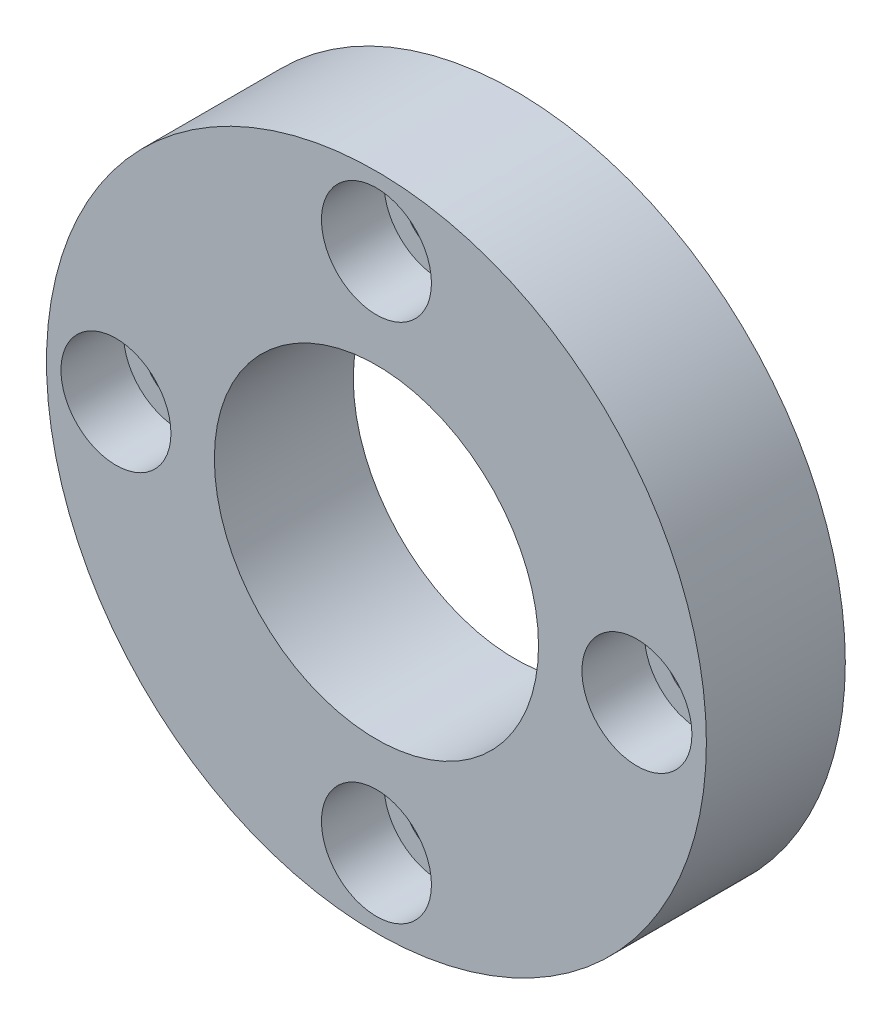
ISO-10303-21;
HEADER;
FILE_DESCRIPTION(('STEP AP214'),'2;1');
FILE_NAME('part.step','',(''),(''),'','','');
FILE_SCHEMA(('AUTOMOTIVE_DESIGN { 1 0 10303 214 1 1 1 1 }'));
ENDSEC;
DATA;
#1=APPLICATION_CONTEXT('core data for automotive mechanical design processes');
#2=APPLICATION_PROTOCOL_DEFINITION('international standard','automotive_design',2000,#1);
#3=PRODUCT_CONTEXT('',#1,'mechanical');
#4=PRODUCT('Part','Part','',(#3));
#5=PRODUCT_RELATED_PRODUCT_CATEGORY('part','',(#4));
#6=PRODUCT_DEFINITION_FORMATION('','',#4);
#7=PRODUCT_DEFINITION_CONTEXT('part definition',#1,'design');
#8=PRODUCT_DEFINITION('design','',#6,#7);
#9=PRODUCT_DEFINITION_SHAPE('','',#8);
#10=(LENGTH_UNIT() NAMED_UNIT(*) SI_UNIT(.MILLI.,.METRE.));
#11=(NAMED_UNIT(*) PLANE_ANGLE_UNIT() SI_UNIT($,.RADIAN.));
#12=(NAMED_UNIT(*) SI_UNIT($,.STERADIAN.) SOLID_ANGLE_UNIT());
#13=UNCERTAINTY_MEASURE_WITH_UNIT(LENGTH_MEASURE(1.E-05),#10,'distance_accuracy_value','');
#14=(GEOMETRIC_REPRESENTATION_CONTEXT(3) GLOBAL_UNCERTAINTY_ASSIGNED_CONTEXT((#13)) GLOBAL_UNIT_ASSIGNED_CONTEXT((#10,
#11,#12)) REPRESENTATION_CONTEXT('',''));
#15=CARTESIAN_POINT('',(0.,0.,0.));
#16=DIRECTION('',(0.,0.,1.));
#17=DIRECTION('',(1.,0.,0.));
#18=AXIS2_PLACEMENT_3D('',#15,#16,#17);
#19=CARTESIAN_POINT('',(0.,22.5,12.));
#20=DIRECTION('',(0.,0.,-1.));
#21=DIRECTION('',(-1.,0.,0.));
#22=AXIS2_PLACEMENT_3D('',#19,#20,#21);
#23=CYLINDRICAL_SURFACE('',#22,3.);
#24=CARTESIAN_POINT('',(0.,22.5,0.));
#25=DIRECTION('',(0.,0.,1.));
#26=DIRECTION('',(1.,0.,0.));
#27=AXIS2_PLACEMENT_3D('',#24,#25,#26);
#28=CIRCLE('',#27,3.);
#29=CARTESIAN_POINT('',(3.,22.5,0.));
#30=VERTEX_POINT('',#29);
#31=EDGE_CURVE('E79',#30,#30,#28,.T.);
#32=ORIENTED_EDGE('',*,*,#31,.F.);
#33=EDGE_LOOP('',(#32));
#34=FACE_BOUND('',#33,.T.);
#35=CARTESIAN_POINT('',(0.,22.5,6.6));
#36=DIRECTION('',(0.,0.,1.));
#37=DIRECTION('',(1.,0.,0.));
#38=AXIS2_PLACEMENT_3D('',#35,#36,#37);
#39=CIRCLE('',#38,3.);
#40=CARTESIAN_POINT('',(3.,22.5,6.6));
#41=VERTEX_POINT('',#40);
#42=EDGE_CURVE('E36',#41,#41,#39,.T.);
#43=ORIENTED_EDGE('',*,*,#42,.T.);
#44=EDGE_LOOP('',(#43));
#45=FACE_BOUND('',#44,.T.);
#46=ADVANCED_FACE('F32',(#34,#45),#23,.F.);
#47=CARTESIAN_POINT('',(22.5000000000006,6.35355279236968E-13,12.));
#48=DIRECTION('',(0.,0.,-1.));
#49=DIRECTION('',(-1.,0.,0.));
#50=AXIS2_PLACEMENT_3D('',#47,#48,#49);
#51=CYLINDRICAL_SURFACE('',#50,3.);
#52=CARTESIAN_POINT('',(22.5000000000006,6.35355279236968E-13,0.));
#53=DIRECTION('',(0.,0.,1.));
#54=DIRECTION('',(1.,0.,0.));
#55=AXIS2_PLACEMENT_3D('',#52,#53,#54);
#56=CIRCLE('',#55,3.);
#57=CARTESIAN_POINT('',(25.5000000000006,6.35355279236968E-13,0.));
#58=VERTEX_POINT('',#57);
#59=EDGE_CURVE('E71',#58,#58,#56,.T.);
#60=ORIENTED_EDGE('',*,*,#59,.F.);
#61=EDGE_LOOP('',(#60));
#62=FACE_BOUND('',#61,.T.);
#63=CARTESIAN_POINT('',(22.5000000000006,6.35355279236968E-13,6.6));
#64=DIRECTION('',(0.,0.,1.));
#65=DIRECTION('',(1.,0.,0.));
#66=AXIS2_PLACEMENT_3D('',#63,#64,#65);
#67=CIRCLE('',#66,3.);
#68=CARTESIAN_POINT('',(25.5000000000006,6.35355279236968E-13,6.6));
#69=VERTEX_POINT('',#68);
#70=EDGE_CURVE('E57',#69,#69,#67,.T.);
#71=ORIENTED_EDGE('',*,*,#70,.T.);
#72=EDGE_LOOP('',(#71));
#73=FACE_BOUND('',#72,.T.);
#74=ADVANCED_FACE('F105',(#62,#73),#51,.F.);
#75=CARTESIAN_POINT('',(1.27071055847394E-12,-22.5,12.));
#76=DIRECTION('',(0.,0.,-1.));
#77=DIRECTION('',(-1.,0.,0.));
#78=AXIS2_PLACEMENT_3D('',#75,#76,#77);
#79=CYLINDRICAL_SURFACE('',#78,3.);
#80=CARTESIAN_POINT('',(1.27071055847394E-12,-22.5,0.));
#81=DIRECTION('',(0.,0.,1.));
#82=DIRECTION('',(1.,0.,0.));
#83=AXIS2_PLACEMENT_3D('',#80,#81,#82);
#84=CIRCLE('',#83,3.);
#85=CARTESIAN_POINT('',(3.00000000000127,-22.5,0.));
#86=VERTEX_POINT('',#85);
#87=EDGE_CURVE('E66',#86,#86,#84,.T.);
#88=ORIENTED_EDGE('',*,*,#87,.F.);
#89=EDGE_LOOP('',(#88));
#90=FACE_BOUND('',#89,.T.);
#91=CARTESIAN_POINT('',(1.27071055847394E-12,-22.5,6.6));
#92=DIRECTION('',(0.,0.,1.));
#93=DIRECTION('',(1.,0.,0.));
#94=AXIS2_PLACEMENT_3D('',#91,#92,#93);
#95=CIRCLE('',#94,3.);
#96=CARTESIAN_POINT('',(3.00000000000127,-22.5,6.6));
#97=VERTEX_POINT('',#96);
#98=EDGE_CURVE('E54',#97,#97,#95,.T.);
#99=ORIENTED_EDGE('',*,*,#98,.T.);
#100=EDGE_LOOP('',(#99));
#101=FACE_BOUND('',#100,.T.);
#102=ADVANCED_FACE('F110',(#90,#101),#79,.F.);
#103=CARTESIAN_POINT('',(-22.4999999999994,-6.38110734535049E-13,12.));
#104=DIRECTION('',(0.,0.,-1.));
#105=DIRECTION('',(-1.,0.,0.));
#106=AXIS2_PLACEMENT_3D('',#103,#104,#105);
#107=CYLINDRICAL_SURFACE('',#106,3.);
#108=CARTESIAN_POINT('',(-22.4999999999994,-6.38110734535049E-13,0.));
#109=DIRECTION('',(0.,0.,1.));
#110=DIRECTION('',(1.,0.,0.));
#111=AXIS2_PLACEMENT_3D('',#108,#109,#110);
#112=CIRCLE('',#111,3.);
#113=CARTESIAN_POINT('',(-19.4999999999994,-6.38110734535049E-13,0.));
#114=VERTEX_POINT('',#113);
#115=EDGE_CURVE('E62',#114,#114,#112,.T.);
#116=ORIENTED_EDGE('',*,*,#115,.F.);
#117=EDGE_LOOP('',(#116));
#118=FACE_BOUND('',#117,.T.);
#119=CARTESIAN_POINT('',(-22.4999999999994,-6.38110734535049E-13,6.6));
#120=DIRECTION('',(0.,0.,1.));
#121=DIRECTION('',(1.,0.,0.));
#122=AXIS2_PLACEMENT_3D('',#119,#120,#121);
#123=CIRCLE('',#122,3.);
#124=CARTESIAN_POINT('',(-19.4999999999994,-6.38110734535049E-13,6.6));
#125=VERTEX_POINT('',#124);
#126=EDGE_CURVE('E51',#125,#125,#123,.T.);
#127=ORIENTED_EDGE('',*,*,#126,.T.);
#128=EDGE_LOOP('',(#127));
#129=FACE_BOUND('',#128,.T.);
#130=ADVANCED_FACE('F117',(#118,#129),#107,.F.);
#131=CARTESIAN_POINT('',(0.,0.,12.));
#132=DIRECTION('',(0.,0.,1.));
#133=DIRECTION('',(1.,0.,0.));
#134=AXIS2_PLACEMENT_3D('',#131,#132,#133);
#135=PLANE('',#134);
#136=CARTESIAN_POINT('',(0.,22.5,12.));
#137=DIRECTION('',(0.,0.,1.));
#138=DIRECTION('',(1.,0.,0.));
#139=AXIS2_PLACEMENT_3D('',#136,#137,#138);
#140=CIRCLE('',#139,4.75);
#141=CARTESIAN_POINT('',(4.75,22.5,12.));
#142=VERTEX_POINT('',#141);
#143=EDGE_CURVE('E154',#142,#142,#140,.T.);
#144=ORIENTED_EDGE('',*,*,#143,.F.);
#145=EDGE_LOOP('',(#144));
#146=FACE_BOUND('',#145,.T.);
#147=CARTESIAN_POINT('',(22.5000000000006,6.35355279236968E-13,12.));
#148=DIRECTION('',(0.,0.,1.));
#149=DIRECTION('',(1.,0.,0.));
#150=AXIS2_PLACEMENT_3D('',#147,#148,#149);
#151=CIRCLE('',#150,4.7500000000005);
#152=CARTESIAN_POINT('',(27.2500000000011,6.35355279236968E-13,12.));
#153=VERTEX_POINT('',#152);
#154=EDGE_CURVE('E162',#153,#153,#151,.T.);
#155=ORIENTED_EDGE('',*,*,#154,.F.);
#156=EDGE_LOOP('',(#155));
#157=FACE_BOUND('',#156,.T.);
#158=CARTESIAN_POINT('',(1.27071055847394E-12,-22.5,12.));
#159=DIRECTION('',(0.,0.,1.));
#160=DIRECTION('',(1.,0.,0.));
#161=AXIS2_PLACEMENT_3D('',#158,#159,#160);
#162=CIRCLE('',#161,4.75000000000137);
#163=CARTESIAN_POINT('',(4.75000000000264,-22.5,12.));
#164=VERTEX_POINT('',#163);
#165=EDGE_CURVE('E168',#164,#164,#162,.T.);
#166=ORIENTED_EDGE('',*,*,#165,.F.);
#167=EDGE_LOOP('',(#166));
#168=FACE_BOUND('',#167,.T.);
#169=CARTESIAN_POINT('',(-22.4999999999994,-6.38110734535049E-13,12.));
#170=DIRECTION('',(0.,0.,1.));
#171=DIRECTION('',(1.,0.,0.));
#172=AXIS2_PLACEMENT_3D('',#169,#170,#171);
#173=CIRCLE('',#172,4.75000000000102);
#174=CARTESIAN_POINT('',(-17.7499999999983,-6.38110734535049E-13,12.));
#175=VERTEX_POINT('',#174);
#176=EDGE_CURVE('E74',#175,#175,#173,.T.);
#177=ORIENTED_EDGE('',*,*,#176,.F.);
#178=EDGE_LOOP('',(#177));
#179=FACE_BOUND('',#178,.T.);
#180=CARTESIAN_POINT('',(0.,0.,12.));
#181=DIRECTION('',(0.,0.,1.));
#182=DIRECTION('',(1.,0.,0.));
#183=AXIS2_PLACEMENT_3D('',#180,#181,#182);
#184=CIRCLE('',#183,28.5);
#185=CARTESIAN_POINT('',(28.5,0.,12.));
#186=VERTEX_POINT('',#185);
#187=EDGE_CURVE('E10',#186,#186,#184,.T.);
#188=ORIENTED_EDGE('',*,*,#187,.T.);
#189=EDGE_LOOP('',(#188));
#190=FACE_BOUND('',#189,.T.);
#191=CARTESIAN_POINT('',(0.,0.,12.));
#192=DIRECTION('',(0.,0.,1.));
#193=DIRECTION('',(1.,0.,0.));
#194=AXIS2_PLACEMENT_3D('',#191,#192,#193);
#195=CIRCLE('',#194,14.);
#196=CARTESIAN_POINT('',(14.,0.,12.));
#197=VERTEX_POINT('',#196);
#198=EDGE_CURVE('E45',#197,#197,#195,.T.);
#199=ORIENTED_EDGE('',*,*,#198,.F.);
#200=EDGE_LOOP('',(#199));
#201=FACE_BOUND('',#200,.T.);
#202=ADVANCED_FACE('F120',(#146,#157,#168,#179,#190,#201),#135,.T.);
#203=CARTESIAN_POINT('',(0.,0.,0.));
#204=DIRECTION('',(0.,0.,1.));
#205=DIRECTION('',(1.,0.,0.));
#206=AXIS2_PLACEMENT_3D('',#203,#204,#205);
#207=PLANE('',#206);
#208=CARTESIAN_POINT('',(0.,0.,0.));
#209=DIRECTION('',(0.,0.,1.));
#210=DIRECTION('',(1.,0.,0.));
#211=AXIS2_PLACEMENT_3D('',#208,#209,#210);
#212=CIRCLE('',#211,28.5);
#213=CARTESIAN_POINT('',(28.5,0.,0.));
#214=VERTEX_POINT('',#213);
#215=EDGE_CURVE('E40',#214,#214,#212,.T.);
#216=ORIENTED_EDGE('',*,*,#215,.F.);
#217=EDGE_LOOP('',(#216));
#218=FACE_BOUND('',#217,.T.);
#219=CARTESIAN_POINT('',(0.,0.,0.));
#220=DIRECTION('',(0.,0.,1.));
#221=DIRECTION('',(1.,0.,0.));
#222=AXIS2_PLACEMENT_3D('',#219,#220,#221);
#223=CIRCLE('',#222,14.);
#224=CARTESIAN_POINT('',(14.,0.,0.));
#225=VERTEX_POINT('',#224);
#226=EDGE_CURVE('E48',#225,#225,#223,.T.);
#227=ORIENTED_EDGE('',*,*,#226,.T.);
#228=EDGE_LOOP('',(#227));
#229=FACE_BOUND('',#228,.T.);
#230=ORIENTED_EDGE('',*,*,#31,.T.);
#231=EDGE_LOOP('',(#230));
#232=FACE_BOUND('',#231,.T.);
#233=ORIENTED_EDGE('',*,*,#59,.T.);
#234=EDGE_LOOP('',(#233));
#235=FACE_BOUND('',#234,.T.);
#236=ORIENTED_EDGE('',*,*,#87,.T.);
#237=EDGE_LOOP('',(#236));
#238=FACE_BOUND('',#237,.T.);
#239=ORIENTED_EDGE('',*,*,#115,.T.);
#240=EDGE_LOOP('',(#239));
#241=FACE_BOUND('',#240,.T.);
#242=ADVANCED_FACE('F87',(#218,#229,#232,#235,#238,#241),#207,.F.);
#243=CARTESIAN_POINT('',(0.,0.,12.));
#244=DIRECTION('',(0.,0.,-1.));
#245=DIRECTION('',(-1.,0.,0.));
#246=AXIS2_PLACEMENT_3D('',#243,#244,#245);
#247=CYLINDRICAL_SURFACE('',#246,28.5);
#248=ORIENTED_EDGE('',*,*,#187,.F.);
#249=EDGE_LOOP('',(#248));
#250=FACE_BOUND('',#249,.T.);
#251=ORIENTED_EDGE('',*,*,#215,.T.);
#252=EDGE_LOOP('',(#251));
#253=FACE_BOUND('',#252,.T.);
#254=ADVANCED_FACE('F34',(#250,#253),#247,.T.);
#255=CARTESIAN_POINT('',(0.,0.,12.));
#256=DIRECTION('',(0.,0.,-1.));
#257=DIRECTION('',(-1.,0.,0.));
#258=AXIS2_PLACEMENT_3D('',#255,#256,#257);
#259=CYLINDRICAL_SURFACE('',#258,14.);
#260=ORIENTED_EDGE('',*,*,#198,.T.);
#261=EDGE_LOOP('',(#260));
#262=FACE_BOUND('',#261,.T.);
#263=ORIENTED_EDGE('',*,*,#226,.F.);
#264=EDGE_LOOP('',(#263));
#265=FACE_BOUND('',#264,.T.);
#266=ADVANCED_FACE('F90',(#262,#265),#259,.F.);
#267=CARTESIAN_POINT('',(-22.4999999999994,-6.38110734535049E-13,6.6));
#268=DIRECTION('',(0.,0.,1.));
#269=DIRECTION('',(1.,0.,0.));
#270=AXIS2_PLACEMENT_3D('',#267,#268,#269);
#271=CYLINDRICAL_SURFACE('',#270,4.75000000000102);
#272=CARTESIAN_POINT('',(-22.4999999999994,-6.38110734535049E-13,6.6));
#273=DIRECTION('',(0.,0.,1.));
#274=DIRECTION('',(1.,0.,0.));
#275=AXIS2_PLACEMENT_3D('',#272,#273,#274);
#276=CIRCLE('',#275,4.75000000000102);
#277=CARTESIAN_POINT('',(-17.7499999999983,-6.38110734535049E-13,6.6));
#278=VERTEX_POINT('',#277);
#279=EDGE_CURVE('E170',#278,#278,#276,.T.);
#280=CARTESIAN_POINT('',(-17.7499999999983,-6.38110734535049E-13,6.6));
#281=CARTESIAN_POINT('',(-17.7499999999983,-6.38110734535049E-13,6.65625));
#282=CARTESIAN_POINT('',(-17.7499999999983,-6.38110734535049E-13,6.7125));
#283=CARTESIAN_POINT('',(-17.7499999999983,-6.38110734535049E-13,6.825));
#284=CARTESIAN_POINT('',(-17.7499999999983,-6.38110734535049E-13,6.88125));
#285=CARTESIAN_POINT('',(-17.7499999999983,-6.38110734535049E-13,6.99375));
#286=CARTESIAN_POINT('',(-17.7499999999983,-6.38110734535049E-13,7.05));
#287=CARTESIAN_POINT('',(-17.7499999999983,-6.38110734535049E-13,7.1625));
#288=CARTESIAN_POINT('',(-17.7499999999983,-6.38110734535049E-13,7.21875));
#289=CARTESIAN_POINT('',(-17.7499999999983,-6.38110734535049E-13,7.33125));
#290=CARTESIAN_POINT('',(-17.7499999999983,-6.38110734535049E-13,7.3875));
#291=CARTESIAN_POINT('',(-17.7499999999983,-6.38110734535049E-13,7.5));
#292=CARTESIAN_POINT('',(-17.7499999999983,-6.38110734535049E-13,7.55625));
#293=CARTESIAN_POINT('',(-17.7499999999983,-6.38110734535049E-13,7.66875));
#294=CARTESIAN_POINT('',(-17.7499999999983,-6.38110734535049E-13,7.725));
#295=CARTESIAN_POINT('',(-17.7499999999983,-6.38110734535049E-13,7.8375));
#296=CARTESIAN_POINT('',(-17.7499999999983,-6.38110734535049E-13,7.89375));
#297=CARTESIAN_POINT('',(-17.7499999999983,-6.38110734535049E-13,8.00625));
#298=CARTESIAN_POINT('',(-17.7499999999983,-6.38110734535049E-13,8.0625));
#299=CARTESIAN_POINT('',(-17.7499999999983,-6.38110734535049E-13,8.175));
#300=CARTESIAN_POINT('',(-17.7499999999983,-6.38110734535049E-13,8.23125));
#301=CARTESIAN_POINT('',(-17.7499999999983,-6.38110734535049E-13,8.34375));
#302=CARTESIAN_POINT('',(-17.7499999999983,-6.38110734535049E-13,8.4));
#303=CARTESIAN_POINT('',(-17.7499999999983,-6.38110734535049E-13,8.5125));
#304=CARTESIAN_POINT('',(-17.7499999999983,-6.38110734535049E-13,8.56875));
#305=CARTESIAN_POINT('',(-17.7499999999983,-6.38110734535049E-13,8.68125));
#306=CARTESIAN_POINT('',(-17.7499999999983,-6.38110734535049E-13,8.7375));
#307=CARTESIAN_POINT('',(-17.7499999999983,-6.38110734535049E-13,8.85));
#308=CARTESIAN_POINT('',(-17.7499999999983,-6.38110734535049E-13,8.90625));
#309=CARTESIAN_POINT('',(-17.7499999999983,-6.38110734535049E-13,9.01875));
#310=CARTESIAN_POINT('',(-17.7499999999983,-6.38110734535049E-13,9.075));
#311=CARTESIAN_POINT('',(-17.7499999999983,-6.38110734535049E-13,9.1875));
#312=CARTESIAN_POINT('',(-17.7499999999983,-6.38110734535049E-13,9.24375));
#313=CARTESIAN_POINT('',(-17.7499999999983,-6.38110734535049E-13,9.35625));
#314=CARTESIAN_POINT('',(-17.7499999999983,-6.38110734535049E-13,9.4125));
#315=CARTESIAN_POINT('',(-17.7499999999983,-6.38110734535049E-13,9.525));
#316=CARTESIAN_POINT('',(-17.7499999999983,-6.38110734535049E-13,9.58125));
#317=CARTESIAN_POINT('',(-17.7499999999983,-6.38110734535049E-13,9.69375));
#318=CARTESIAN_POINT('',(-17.7499999999983,-6.38110734535049E-13,9.75));
#319=CARTESIAN_POINT('',(-17.7499999999983,-6.38110734535049E-13,9.8625));
#320=CARTESIAN_POINT('',(-17.7499999999983,-6.38110734535049E-13,9.91875));
#321=CARTESIAN_POINT('',(-17.7499999999983,-6.38110734535049E-13,10.03125));
#322=CARTESIAN_POINT('',(-17.7499999999983,-6.38110734535049E-13,10.0875));
#323=CARTESIAN_POINT('',(-17.7499999999983,-6.38110734535049E-13,10.2));
#324=CARTESIAN_POINT('',(-17.7499999999983,-6.38110734535049E-13,10.25625));
#325=CARTESIAN_POINT('',(-17.7499999999983,-6.38110734535049E-13,10.36875));
#326=CARTESIAN_POINT('',(-17.7499999999983,-6.38110734535049E-13,10.425));
#327=CARTESIAN_POINT('',(-17.7499999999983,-6.38110734535049E-13,10.5375));
#328=CARTESIAN_POINT('',(-17.7499999999983,-6.38110734535049E-13,10.59375));
#329=CARTESIAN_POINT('',(-17.7499999999983,-6.38110734535049E-13,10.70625));
#330=CARTESIAN_POINT('',(-17.7499999999983,-6.38110734535049E-13,10.7625));
#331=CARTESIAN_POINT('',(-17.7499999999983,-6.38110734535049E-13,10.875));
#332=CARTESIAN_POINT('',(-17.7499999999983,-6.38110734535049E-13,10.93125));
#333=CARTESIAN_POINT('',(-17.7499999999983,-6.38110734535049E-13,11.04375));
#334=CARTESIAN_POINT('',(-17.7499999999983,-6.38110734535049E-13,11.1));
#335=CARTESIAN_POINT('',(-17.7499999999983,-6.38110734535049E-13,11.2125));
#336=CARTESIAN_POINT('',(-17.7499999999983,-6.38110734535049E-13,11.26875));
#337=CARTESIAN_POINT('',(-17.7499999999983,-6.38110734535049E-13,11.38125));
#338=CARTESIAN_POINT('',(-17.7499999999983,-6.38110734535049E-13,11.4375));
#339=CARTESIAN_POINT('',(-17.7499999999983,-6.38110734535049E-13,11.55));
#340=CARTESIAN_POINT('',(-17.7499999999983,-6.38110734535049E-13,11.60625));
#341=CARTESIAN_POINT('',(-17.7499999999983,-6.38110734535049E-13,11.71875));
#342=CARTESIAN_POINT('',(-17.7499999999983,-6.38110734535049E-13,11.775));
#343=CARTESIAN_POINT('',(-17.7499999999983,-6.38110734535049E-13,11.8875));
#344=CARTESIAN_POINT('',(-17.7499999999983,-6.38110734535049E-13,11.94375));
#345=CARTESIAN_POINT('',(-17.7499999999983,-6.38110734535049E-13,12.));
#346=B_SPLINE_CURVE_WITH_KNOTS('',3,(#280,#281,#282,#283,#284,#285,#286,#287,#288,#289,#290,
#291,#292,#293,#294,#295,#296,#297,#298,#299,#300,#301,#302,#303,#304,#305,#306,#307,#308,#309,
#310,#311,#312,#313,#314,#315,#316,#317,#318,#319,#320,#321,#322,#323,#324,#325,#326,#327,#328,
#329,#330,#331,#332,#333,#334,#335,#336,#337,#338,#339,#340,#341,#342,#343,#344,#345),
.UNSPECIFIED.,.F.,.F.,(4,2,2,2,2,2,2,2,2,2,2,2,2,2,2,2,2,2,2,2,2,2,2,2,2,2,2,2,2,2,2,2,4),(0.,
0.168750000000001,0.3375,0.506250000000001,0.675,0.843750000000001,1.0125,1.18125,1.35,1.51875,
1.6875,1.85625,2.025,2.19375,2.3625,2.53125,2.7,2.86875,3.0375,3.20625,3.375,3.54375,3.7125,
3.88125,4.05,4.21875,4.3875,4.55625,4.725,4.89375,5.0625,5.23125,5.4),.UNSPECIFIED.);
#347=EDGE_CURVE('BSEAM92',#278,#175,#346,.T.);
#348=ORIENTED_EDGE('',*,*,#279,.F.);
#349=ORIENTED_EDGE('',*,*,#176,.T.);
#350=ORIENTED_EDGE('',*,*,#347,.T.);
#351=ORIENTED_EDGE('',*,*,#347,.F.);
#352=EDGE_LOOP('',(#348,#350,#349,#351));
#353=FACE_BOUND('',#352,.T.);
#354=ADVANCED_FACE('F92',(#353),#271,.F.);
#355=CARTESIAN_POINT('',(-22.4999999999994,-6.38110734535049E-13,6.6));
#356=DIRECTION('',(0.,0.,1.));
#357=DIRECTION('',(1.,0.,0.));
#358=AXIS2_PLACEMENT_3D('',#355,#356,#357);
#359=PLANE('',#358);
#360=ORIENTED_EDGE('',*,*,#126,.F.);
#361=EDGE_LOOP('',(#360));
#362=FACE_BOUND('',#361,.T.);
#363=ORIENTED_EDGE('',*,*,#279,.T.);
#364=EDGE_LOOP('',(#363));
#365=FACE_BOUND('',#364,.T.);
#366=ADVANCED_FACE('F98',(#362,#365),#359,.T.);
#367=CARTESIAN_POINT('',(1.27071055847394E-12,-22.5,6.6));
#368=DIRECTION('',(0.,0.,1.));
#369=DIRECTION('',(1.,0.,0.));
#370=AXIS2_PLACEMENT_3D('',#367,#368,#369);
#371=CYLINDRICAL_SURFACE('',#370,4.75000000000137);
#372=CARTESIAN_POINT('',(1.27071055847394E-12,-22.5,6.6));
#373=DIRECTION('',(0.,0.,1.));
#374=DIRECTION('',(1.,0.,0.));
#375=AXIS2_PLACEMENT_3D('',#372,#373,#374);
#376=CIRCLE('',#375,4.75000000000137);
#377=CARTESIAN_POINT('',(4.75000000000264,-22.5,6.6));
#378=VERTEX_POINT('',#377);
#379=EDGE_CURVE('E165',#378,#378,#376,.T.);
#380=CARTESIAN_POINT('',(4.75000000000264,-22.5,6.6));
#381=CARTESIAN_POINT('',(4.75000000000264,-22.5,6.65625));
#382=CARTESIAN_POINT('',(4.75000000000264,-22.5,6.7125));
#383=CARTESIAN_POINT('',(4.75000000000264,-22.5,6.825));
#384=CARTESIAN_POINT('',(4.75000000000264,-22.5,6.88125));
#385=CARTESIAN_POINT('',(4.75000000000264,-22.5,6.99375));
#386=CARTESIAN_POINT('',(4.75000000000264,-22.5,7.05));
#387=CARTESIAN_POINT('',(4.75000000000264,-22.5,7.1625));
#388=CARTESIAN_POINT('',(4.75000000000264,-22.5,7.21875));
#389=CARTESIAN_POINT('',(4.75000000000264,-22.5,7.33125));
#390=CARTESIAN_POINT('',(4.75000000000264,-22.5,7.3875));
#391=CARTESIAN_POINT('',(4.75000000000264,-22.5,7.5));
#392=CARTESIAN_POINT('',(4.75000000000264,-22.5,7.55625));
#393=CARTESIAN_POINT('',(4.75000000000264,-22.5,7.66875));
#394=CARTESIAN_POINT('',(4.75000000000264,-22.5,7.725));
#395=CARTESIAN_POINT('',(4.75000000000264,-22.5,7.8375));
#396=CARTESIAN_POINT('',(4.75000000000264,-22.5,7.89375));
#397=CARTESIAN_POINT('',(4.75000000000264,-22.5,8.00625));
#398=CARTESIAN_POINT('',(4.75000000000264,-22.5,8.0625));
#399=CARTESIAN_POINT('',(4.75000000000264,-22.5,8.175));
#400=CARTESIAN_POINT('',(4.75000000000264,-22.5,8.23125));
#401=CARTESIAN_POINT('',(4.75000000000264,-22.5,8.34375));
#402=CARTESIAN_POINT('',(4.75000000000264,-22.5,8.4));
#403=CARTESIAN_POINT('',(4.75000000000264,-22.5,8.5125));
#404=CARTESIAN_POINT('',(4.75000000000264,-22.5,8.56875));
#405=CARTESIAN_POINT('',(4.75000000000264,-22.5,8.68125));
#406=CARTESIAN_POINT('',(4.75000000000264,-22.5,8.7375));
#407=CARTESIAN_POINT('',(4.75000000000264,-22.5,8.85));
#408=CARTESIAN_POINT('',(4.75000000000264,-22.5,8.90625));
#409=CARTESIAN_POINT('',(4.75000000000264,-22.5,9.01875));
#410=CARTESIAN_POINT('',(4.75000000000264,-22.5,9.075));
#411=CARTESIAN_POINT('',(4.75000000000264,-22.5,9.1875));
#412=CARTESIAN_POINT('',(4.75000000000264,-22.5,9.24375));
#413=CARTESIAN_POINT('',(4.75000000000264,-22.5,9.35625));
#414=CARTESIAN_POINT('',(4.75000000000264,-22.5,9.4125));
#415=CARTESIAN_POINT('',(4.75000000000264,-22.5,9.525));
#416=CARTESIAN_POINT('',(4.75000000000264,-22.5,9.58125));
#417=CARTESIAN_POINT('',(4.75000000000264,-22.5,9.69375));
#418=CARTESIAN_POINT('',(4.75000000000264,-22.5,9.75));
#419=CARTESIAN_POINT('',(4.75000000000264,-22.5,9.8625));
#420=CARTESIAN_POINT('',(4.75000000000264,-22.5,9.91875));
#421=CARTESIAN_POINT('',(4.75000000000264,-22.5,10.03125));
#422=CARTESIAN_POINT('',(4.75000000000264,-22.5,10.0875));
#423=CARTESIAN_POINT('',(4.75000000000264,-22.5,10.2));
#424=CARTESIAN_POINT('',(4.75000000000264,-22.5,10.25625));
#425=CARTESIAN_POINT('',(4.75000000000264,-22.5,10.36875));
#426=CARTESIAN_POINT('',(4.75000000000264,-22.5,10.425));
#427=CARTESIAN_POINT('',(4.75000000000264,-22.5,10.5375));
#428=CARTESIAN_POINT('',(4.75000000000264,-22.5,10.59375));
#429=CARTESIAN_POINT('',(4.75000000000264,-22.5,10.70625));
#430=CARTESIAN_POINT('',(4.75000000000264,-22.5,10.7625));
#431=CARTESIAN_POINT('',(4.75000000000264,-22.5,10.875));
#432=CARTESIAN_POINT('',(4.75000000000264,-22.5,10.93125));
#433=CARTESIAN_POINT('',(4.75000000000264,-22.5,11.04375));
#434=CARTESIAN_POINT('',(4.75000000000264,-22.5,11.1));
#435=CARTESIAN_POINT('',(4.75000000000264,-22.5,11.2125));
#436=CARTESIAN_POINT('',(4.75000000000264,-22.5,11.26875));
#437=CARTESIAN_POINT('',(4.75000000000264,-22.5,11.38125));
#438=CARTESIAN_POINT('',(4.75000000000264,-22.5,11.4375));
#439=CARTESIAN_POINT('',(4.75000000000264,-22.5,11.55));
#440=CARTESIAN_POINT('',(4.75000000000264,-22.5,11.60625));
#441=CARTESIAN_POINT('',(4.75000000000264,-22.5,11.71875));
#442=CARTESIAN_POINT('',(4.75000000000264,-22.5,11.775));
#443=CARTESIAN_POINT('',(4.75000000000264,-22.5,11.8875));
#444=CARTESIAN_POINT('',(4.75000000000264,-22.5,11.94375));
#445=CARTESIAN_POINT('',(4.75000000000264,-22.5,12.));
#446=B_SPLINE_CURVE_WITH_KNOTS('',3,(#380,#381,#382,#383,#384,#385,#386,#387,#388,#389,#390,
#391,#392,#393,#394,#395,#396,#397,#398,#399,#400,#401,#402,#403,#404,#405,#406,#407,#408,#409,
#410,#411,#412,#413,#414,#415,#416,#417,#418,#419,#420,#421,#422,#423,#424,#425,#426,#427,#428,
#429,#430,#431,#432,#433,#434,#435,#436,#437,#438,#439,#440,#441,#442,#443,#444,#445),
.UNSPECIFIED.,.F.,.F.,(4,2,2,2,2,2,2,2,2,2,2,2,2,2,2,2,2,2,2,2,2,2,2,2,2,2,2,2,2,2,2,2,4),(0.,
0.168750000000001,0.3375,0.506250000000001,0.675,0.843750000000001,1.0125,1.18125,1.35,1.51875,
1.6875,1.85625,2.025,2.19375,2.3625,2.53125,2.7,2.86875,3.0375,3.20625,3.375,3.54375,3.7125,
3.88125,4.05,4.21875,4.3875,4.55625,4.725,4.89375,5.0625,5.23125,5.4),.UNSPECIFIED.);
#447=EDGE_CURVE('BSEAM125',#378,#164,#446,.T.);
#448=ORIENTED_EDGE('',*,*,#379,.F.);
#449=ORIENTED_EDGE('',*,*,#165,.T.);
#450=ORIENTED_EDGE('',*,*,#447,.T.);
#451=ORIENTED_EDGE('',*,*,#447,.F.);
#452=EDGE_LOOP('',(#448,#450,#449,#451));
#453=FACE_BOUND('',#452,.T.);
#454=ADVANCED_FACE('F125',(#453),#371,.F.);
#455=CARTESIAN_POINT('',(1.27071055847394E-12,-22.5,6.6));
#456=DIRECTION('',(0.,0.,1.));
#457=DIRECTION('',(1.,0.,0.));
#458=AXIS2_PLACEMENT_3D('',#455,#456,#457);
#459=PLANE('',#458);
#460=ORIENTED_EDGE('',*,*,#98,.F.);
#461=EDGE_LOOP('',(#460));
#462=FACE_BOUND('',#461,.T.);
#463=ORIENTED_EDGE('',*,*,#379,.T.);
#464=EDGE_LOOP('',(#463));
#465=FACE_BOUND('',#464,.T.);
#466=ADVANCED_FACE('F129',(#462,#465),#459,.T.);
#467=CARTESIAN_POINT('',(22.5000000000006,6.35355279236968E-13,6.6));
#468=DIRECTION('',(0.,0.,1.));
#469=DIRECTION('',(1.,0.,0.));
#470=AXIS2_PLACEMENT_3D('',#467,#468,#469);
#471=CYLINDRICAL_SURFACE('',#470,4.7500000000005);
#472=CARTESIAN_POINT('',(22.5000000000006,6.35355279236968E-13,6.6));
#473=DIRECTION('',(0.,0.,1.));
#474=DIRECTION('',(1.,0.,0.));
#475=AXIS2_PLACEMENT_3D('',#472,#473,#474);
#476=CIRCLE('',#475,4.7500000000005);
#477=CARTESIAN_POINT('',(27.2500000000011,6.35355279236968E-13,6.6));
#478=VERTEX_POINT('',#477);
#479=EDGE_CURVE('E157',#478,#478,#476,.T.);
#480=CARTESIAN_POINT('',(27.2500000000011,6.35355279236968E-13,6.6));
#481=CARTESIAN_POINT('',(27.2500000000011,6.35355279236968E-13,6.65625));
#482=CARTESIAN_POINT('',(27.2500000000011,6.35355279236968E-13,6.7125));
#483=CARTESIAN_POINT('',(27.2500000000011,6.35355279236968E-13,6.825));
#484=CARTESIAN_POINT('',(27.2500000000011,6.35355279236968E-13,6.88125));
#485=CARTESIAN_POINT('',(27.2500000000011,6.35355279236968E-13,6.99375));
#486=CARTESIAN_POINT('',(27.2500000000011,6.35355279236968E-13,7.05));
#487=CARTESIAN_POINT('',(27.2500000000011,6.35355279236968E-13,7.1625));
#488=CARTESIAN_POINT('',(27.2500000000011,6.35355279236968E-13,7.21875));
#489=CARTESIAN_POINT('',(27.2500000000011,6.35355279236968E-13,7.33125));
#490=CARTESIAN_POINT('',(27.2500000000011,6.35355279236968E-13,7.3875));
#491=CARTESIAN_POINT('',(27.2500000000011,6.35355279236968E-13,7.5));
#492=CARTESIAN_POINT('',(27.2500000000011,6.35355279236968E-13,7.55625));
#493=CARTESIAN_POINT('',(27.2500000000011,6.35355279236968E-13,7.66875));
#494=CARTESIAN_POINT('',(27.2500000000011,6.35355279236968E-13,7.725));
#495=CARTESIAN_POINT('',(27.2500000000011,6.35355279236968E-13,7.8375));
#496=CARTESIAN_POINT('',(27.2500000000011,6.35355279236968E-13,7.89375));
#497=CARTESIAN_POINT('',(27.2500000000011,6.35355279236968E-13,8.00625));
#498=CARTESIAN_POINT('',(27.2500000000011,6.35355279236968E-13,8.0625));
#499=CARTESIAN_POINT('',(27.2500000000011,6.35355279236968E-13,8.175));
#500=CARTESIAN_POINT('',(27.2500000000011,6.35355279236968E-13,8.23125));
#501=CARTESIAN_POINT('',(27.2500000000011,6.35355279236968E-13,8.34375));
#502=CARTESIAN_POINT('',(27.2500000000011,6.35355279236968E-13,8.4));
#503=CARTESIAN_POINT('',(27.2500000000011,6.35355279236968E-13,8.5125));
#504=CARTESIAN_POINT('',(27.2500000000011,6.35355279236968E-13,8.56875));
#505=CARTESIAN_POINT('',(27.2500000000011,6.35355279236968E-13,8.68125));
#506=CARTESIAN_POINT('',(27.2500000000011,6.35355279236968E-13,8.7375));
#507=CARTESIAN_POINT('',(27.2500000000011,6.35355279236968E-13,8.85));
#508=CARTESIAN_POINT('',(27.2500000000011,6.35355279236968E-13,8.90625));
#509=CARTESIAN_POINT('',(27.2500000000011,6.35355279236968E-13,9.01875));
#510=CARTESIAN_POINT('',(27.2500000000011,6.35355279236968E-13,9.075));
#511=CARTESIAN_POINT('',(27.2500000000011,6.35355279236968E-13,9.1875));
#512=CARTESIAN_POINT('',(27.2500000000011,6.35355279236968E-13,9.24375));
#513=CARTESIAN_POINT('',(27.2500000000011,6.35355279236968E-13,9.35625));
#514=CARTESIAN_POINT('',(27.2500000000011,6.35355279236968E-13,9.4125));
#515=CARTESIAN_POINT('',(27.2500000000011,6.35355279236968E-13,9.525));
#516=CARTESIAN_POINT('',(27.2500000000011,6.35355279236968E-13,9.58125));
#517=CARTESIAN_POINT('',(27.2500000000011,6.35355279236968E-13,9.69375));
#518=CARTESIAN_POINT('',(27.2500000000011,6.35355279236968E-13,9.75));
#519=CARTESIAN_POINT('',(27.2500000000011,6.35355279236968E-13,9.8625));
#520=CARTESIAN_POINT('',(27.2500000000011,6.35355279236968E-13,9.91875));
#521=CARTESIAN_POINT('',(27.2500000000011,6.35355279236968E-13,10.03125));
#522=CARTESIAN_POINT('',(27.2500000000011,6.35355279236968E-13,10.0875));
#523=CARTESIAN_POINT('',(27.2500000000011,6.35355279236968E-13,10.2));
#524=CARTESIAN_POINT('',(27.2500000000011,6.35355279236968E-13,10.25625));
#525=CARTESIAN_POINT('',(27.2500000000011,6.35355279236968E-13,10.36875));
#526=CARTESIAN_POINT('',(27.2500000000011,6.35355279236968E-13,10.425));
#527=CARTESIAN_POINT('',(27.2500000000011,6.35355279236968E-13,10.5375));
#528=CARTESIAN_POINT('',(27.2500000000011,6.35355279236968E-13,10.59375));
#529=CARTESIAN_POINT('',(27.2500000000011,6.35355279236968E-13,10.70625));
#530=CARTESIAN_POINT('',(27.2500000000011,6.35355279236968E-13,10.7625));
#531=CARTESIAN_POINT('',(27.2500000000011,6.35355279236968E-13,10.875));
#532=CARTESIAN_POINT('',(27.2500000000011,6.35355279236968E-13,10.93125));
#533=CARTESIAN_POINT('',(27.2500000000011,6.35355279236968E-13,11.04375));
#534=CARTESIAN_POINT('',(27.2500000000011,6.35355279236968E-13,11.1));
#535=CARTESIAN_POINT('',(27.2500000000011,6.35355279236968E-13,11.2125));
#536=CARTESIAN_POINT('',(27.2500000000011,6.35355279236968E-13,11.26875));
#537=CARTESIAN_POINT('',(27.2500000000011,6.35355279236968E-13,11.38125));
#538=CARTESIAN_POINT('',(27.2500000000011,6.35355279236968E-13,11.4375));
#539=CARTESIAN_POINT('',(27.2500000000011,6.35355279236968E-13,11.55));
#540=CARTESIAN_POINT('',(27.2500000000011,6.35355279236968E-13,11.60625));
#541=CARTESIAN_POINT('',(27.2500000000011,6.35355279236968E-13,11.71875));
#542=CARTESIAN_POINT('',(27.2500000000011,6.35355279236968E-13,11.775));
#543=CARTESIAN_POINT('',(27.2500000000011,6.35355279236968E-13,11.8875));
#544=CARTESIAN_POINT('',(27.2500000000011,6.35355279236968E-13,11.94375));
#545=CARTESIAN_POINT('',(27.2500000000011,6.35355279236968E-13,12.));
#546=B_SPLINE_CURVE_WITH_KNOTS('',3,(#480,#481,#482,#483,#484,#485,#486,#487,#488,#489,#490,
#491,#492,#493,#494,#495,#496,#497,#498,#499,#500,#501,#502,#503,#504,#505,#506,#507,#508,#509,
#510,#511,#512,#513,#514,#515,#516,#517,#518,#519,#520,#521,#522,#523,#524,#525,#526,#527,#528,
#529,#530,#531,#532,#533,#534,#535,#536,#537,#538,#539,#540,#541,#542,#543,#544,#545),
.UNSPECIFIED.,.F.,.F.,(4,2,2,2,2,2,2,2,2,2,2,2,2,2,2,2,2,2,2,2,2,2,2,2,2,2,2,2,2,2,2,2,4),(0.,
0.168750000000001,0.3375,0.506250000000001,0.675,0.843750000000001,1.0125,1.18125,1.35,1.51875,
1.6875,1.85625,2.025,2.19375,2.3625,2.53125,2.7,2.86875,3.0375,3.20625,3.375,3.54375,3.7125,
3.88125,4.05,4.21875,4.3875,4.55625,4.725,4.89375,5.0625,5.23125,5.4),.UNSPECIFIED.);
#547=EDGE_CURVE('BSEAM133',#478,#153,#546,.T.);
#548=ORIENTED_EDGE('',*,*,#479,.F.);
#549=ORIENTED_EDGE('',*,*,#154,.T.);
#550=ORIENTED_EDGE('',*,*,#547,.T.);
#551=ORIENTED_EDGE('',*,*,#547,.F.);
#552=EDGE_LOOP('',(#548,#550,#549,#551));
#553=FACE_BOUND('',#552,.T.);
#554=ADVANCED_FACE('F133',(#553),#471,.F.);
#555=CARTESIAN_POINT('',(22.5000000000006,6.35355279236968E-13,6.6));
#556=DIRECTION('',(0.,0.,1.));
#557=DIRECTION('',(1.,0.,0.));
#558=AXIS2_PLACEMENT_3D('',#555,#556,#557);
#559=PLANE('',#558);
#560=ORIENTED_EDGE('',*,*,#70,.F.);
#561=EDGE_LOOP('',(#560));
#562=FACE_BOUND('',#561,.T.);
#563=ORIENTED_EDGE('',*,*,#479,.T.);
#564=EDGE_LOOP('',(#563));
#565=FACE_BOUND('',#564,.T.);
#566=ADVANCED_FACE('F137',(#562,#565),#559,.T.);
#567=CARTESIAN_POINT('',(0.,22.5,6.6));
#568=DIRECTION('',(0.,0.,1.));
#569=DIRECTION('',(1.,0.,0.));
#570=AXIS2_PLACEMENT_3D('',#567,#568,#569);
#571=CYLINDRICAL_SURFACE('',#570,4.75);
#572=CARTESIAN_POINT('',(0.,22.5,6.6));
#573=DIRECTION('',(0.,0.,1.));
#574=DIRECTION('',(1.,0.,0.));
#575=AXIS2_PLACEMENT_3D('',#572,#573,#574);
#576=CIRCLE('',#575,4.75);
#577=CARTESIAN_POINT('',(4.75,22.5,6.6));
#578=VERTEX_POINT('',#577);
#579=EDGE_CURVE('E55',#578,#578,#576,.T.);
#580=CARTESIAN_POINT('',(4.75,22.5,6.6));
#581=CARTESIAN_POINT('',(4.75,22.5,6.65625));
#582=CARTESIAN_POINT('',(4.75,22.5,6.7125));
#583=CARTESIAN_POINT('',(4.75,22.5,6.825));
#584=CARTESIAN_POINT('',(4.75,22.5,6.88125));
#585=CARTESIAN_POINT('',(4.75,22.5,6.99375));
#586=CARTESIAN_POINT('',(4.75,22.5,7.05));
#587=CARTESIAN_POINT('',(4.75,22.5,7.1625));
#588=CARTESIAN_POINT('',(4.75,22.5,7.21875));
#589=CARTESIAN_POINT('',(4.75,22.5,7.33125));
#590=CARTESIAN_POINT('',(4.75,22.5,7.3875));
#591=CARTESIAN_POINT('',(4.75,22.5,7.5));
#592=CARTESIAN_POINT('',(4.75,22.5,7.55625));
#593=CARTESIAN_POINT('',(4.75,22.5,7.66875));
#594=CARTESIAN_POINT('',(4.75,22.5,7.725));
#595=CARTESIAN_POINT('',(4.75,22.5,7.8375));
#596=CARTESIAN_POINT('',(4.75,22.5,7.89375));
#597=CARTESIAN_POINT('',(4.75,22.5,8.00625));
#598=CARTESIAN_POINT('',(4.75,22.5,8.0625));
#599=CARTESIAN_POINT('',(4.75,22.5,8.175));
#600=CARTESIAN_POINT('',(4.75,22.5,8.23125));
#601=CARTESIAN_POINT('',(4.75,22.5,8.34375));
#602=CARTESIAN_POINT('',(4.75,22.5,8.4));
#603=CARTESIAN_POINT('',(4.75,22.5,8.5125));
#604=CARTESIAN_POINT('',(4.75,22.5,8.56875));
#605=CARTESIAN_POINT('',(4.75,22.5,8.68125));
#606=CARTESIAN_POINT('',(4.75,22.5,8.7375));
#607=CARTESIAN_POINT('',(4.75,22.5,8.85));
#608=CARTESIAN_POINT('',(4.75,22.5,8.90625));
#609=CARTESIAN_POINT('',(4.75,22.5,9.01875));
#610=CARTESIAN_POINT('',(4.75,22.5,9.075));
#611=CARTESIAN_POINT('',(4.75,22.5,9.1875));
#612=CARTESIAN_POINT('',(4.75,22.5,9.24375));
#613=CARTESIAN_POINT('',(4.75,22.5,9.35625));
#614=CARTESIAN_POINT('',(4.75,22.5,9.4125));
#615=CARTESIAN_POINT('',(4.75,22.5,9.525));
#616=CARTESIAN_POINT('',(4.75,22.5,9.58125));
#617=CARTESIAN_POINT('',(4.75,22.5,9.69375));
#618=CARTESIAN_POINT('',(4.75,22.5,9.75));
#619=CARTESIAN_POINT('',(4.75,22.5,9.8625));
#620=CARTESIAN_POINT('',(4.75,22.5,9.91875));
#621=CARTESIAN_POINT('',(4.75,22.5,10.03125));
#622=CARTESIAN_POINT('',(4.75,22.5,10.0875));
#623=CARTESIAN_POINT('',(4.75,22.5,10.2));
#624=CARTESIAN_POINT('',(4.75,22.5,10.25625));
#625=CARTESIAN_POINT('',(4.75,22.5,10.36875));
#626=CARTESIAN_POINT('',(4.75,22.5,10.425));
#627=CARTESIAN_POINT('',(4.75,22.5,10.5375));
#628=CARTESIAN_POINT('',(4.75,22.5,10.59375));
#629=CARTESIAN_POINT('',(4.75,22.5,10.70625));
#630=CARTESIAN_POINT('',(4.75,22.5,10.7625));
#631=CARTESIAN_POINT('',(4.75,22.5,10.875));
#632=CARTESIAN_POINT('',(4.75,22.5,10.93125));
#633=CARTESIAN_POINT('',(4.75,22.5,11.04375));
#634=CARTESIAN_POINT('',(4.75,22.5,11.1));
#635=CARTESIAN_POINT('',(4.75,22.5,11.2125));
#636=CARTESIAN_POINT('',(4.75,22.5,11.26875));
#637=CARTESIAN_POINT('',(4.75,22.5,11.38125));
#638=CARTESIAN_POINT('',(4.75,22.5,11.4375));
#639=CARTESIAN_POINT('',(4.75,22.5,11.55));
#640=CARTESIAN_POINT('',(4.75,22.5,11.60625));
#641=CARTESIAN_POINT('',(4.75,22.5,11.71875));
#642=CARTESIAN_POINT('',(4.75,22.5,11.775));
#643=CARTESIAN_POINT('',(4.75,22.5,11.8875));
#644=CARTESIAN_POINT('',(4.75,22.5,11.94375));
#645=CARTESIAN_POINT('',(4.75,22.5,12.));
#646=B_SPLINE_CURVE_WITH_KNOTS('',3,(#580,#581,#582,#583,#584,#585,#586,#587,#588,#589,#590,
#591,#592,#593,#594,#595,#596,#597,#598,#599,#600,#601,#602,#603,#604,#605,#606,#607,#608,#609,
#610,#611,#612,#613,#614,#615,#616,#617,#618,#619,#620,#621,#622,#623,#624,#625,#626,#627,#628,
#629,#630,#631,#632,#633,#634,#635,#636,#637,#638,#639,#640,#641,#642,#643,#644,#645),
.UNSPECIFIED.,.F.,.F.,(4,2,2,2,2,2,2,2,2,2,2,2,2,2,2,2,2,2,2,2,2,2,2,2,2,2,2,2,2,2,2,2,4),(0.,
0.168750000000001,0.3375,0.506250000000001,0.675,0.843750000000001,1.0125,1.18125,1.35,1.51875,
1.6875,1.85625,2.025,2.19375,2.3625,2.53125,2.7,2.86875,3.0375,3.20625,3.375,3.54375,3.7125,
3.88125,4.05,4.21875,4.3875,4.55625,4.725,4.89375,5.0625,5.23125,5.4),.UNSPECIFIED.);
#647=EDGE_CURVE('BSEAM141',#578,#142,#646,.T.);
#648=ORIENTED_EDGE('',*,*,#579,.F.);
#649=ORIENTED_EDGE('',*,*,#143,.T.);
#650=ORIENTED_EDGE('',*,*,#647,.T.);
#651=ORIENTED_EDGE('',*,*,#647,.F.);
#652=EDGE_LOOP('',(#648,#650,#649,#651));
#653=FACE_BOUND('',#652,.T.);
#654=ADVANCED_FACE('F141',(#653),#571,.F.);
#655=CARTESIAN_POINT('',(0.,22.5,6.6));
#656=DIRECTION('',(0.,0.,1.));
#657=DIRECTION('',(1.,0.,0.));
#658=AXIS2_PLACEMENT_3D('',#655,#656,#657);
#659=PLANE('',#658);
#660=ORIENTED_EDGE('',*,*,#42,.F.);
#661=EDGE_LOOP('',(#660));
#662=FACE_BOUND('',#661,.T.);
#663=ORIENTED_EDGE('',*,*,#579,.T.);
#664=EDGE_LOOP('',(#663));
#665=FACE_BOUND('',#664,.T.);
#666=ADVANCED_FACE('F145',(#662,#665),#659,.T.);
#667=CLOSED_SHELL('',(#46,#74,#102,#130,#202,#242,#254,#266,#354,#366,#454,#466,#554,#566,#654,#666));
#668=MANIFOLD_SOLID_BREP('B2',#667);
#669=ADVANCED_BREP_SHAPE_REPRESENTATION('',(#18,#668),#14);
#670=SHAPE_DEFINITION_REPRESENTATION(#9,#669);
ENDSEC;
END-ISO-10303-21;
